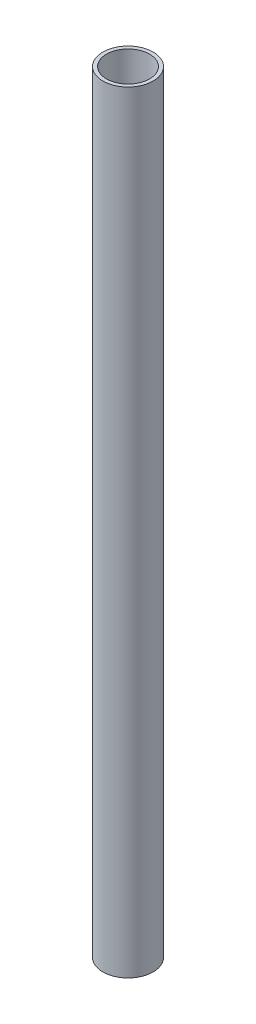
ISO-10303-21;
HEADER;
FILE_DESCRIPTION(('STEP AP214'),'2;1');
FILE_NAME('part.step','',(''),(''),'','','');
FILE_SCHEMA(('AUTOMOTIVE_DESIGN { 1 0 10303 214 1 1 1 1 }'));
ENDSEC;
DATA;
#1=APPLICATION_CONTEXT('core data for automotive mechanical design processes');
#2=APPLICATION_PROTOCOL_DEFINITION('international standard','automotive_design',2000,#1);
#3=PRODUCT_CONTEXT('',#1,'mechanical');
#4=PRODUCT('Part','Part','',(#3));
#5=PRODUCT_RELATED_PRODUCT_CATEGORY('part','',(#4));
#6=PRODUCT_DEFINITION_FORMATION('','',#4);
#7=PRODUCT_DEFINITION_CONTEXT('part definition',#1,'design');
#8=PRODUCT_DEFINITION('design','',#6,#7);
#9=PRODUCT_DEFINITION_SHAPE('','',#8);
#10=(LENGTH_UNIT() NAMED_UNIT(*) SI_UNIT(.MILLI.,.METRE.));
#11=(NAMED_UNIT(*) PLANE_ANGLE_UNIT() SI_UNIT($,.RADIAN.));
#12=(NAMED_UNIT(*) SI_UNIT($,.STERADIAN.) SOLID_ANGLE_UNIT());
#13=UNCERTAINTY_MEASURE_WITH_UNIT(LENGTH_MEASURE(1.E-05),#10,'distance_accuracy_value','');
#14=(GEOMETRIC_REPRESENTATION_CONTEXT(3) GLOBAL_UNCERTAINTY_ASSIGNED_CONTEXT((#13)) GLOBAL_UNIT_ASSIGNED_CONTEXT((#10,
#11,#12)) REPRESENTATION_CONTEXT('',''));
#15=CARTESIAN_POINT('',(0.,0.,0.));
#16=DIRECTION('',(0.,0.,1.));
#17=DIRECTION('',(1.,0.,0.));
#18=AXIS2_PLACEMENT_3D('',#15,#16,#17);
#19=CARTESIAN_POINT('',(0.,-107.5,0.));
#20=DIRECTION('',(0.,1.,0.));
#21=DIRECTION('',(-1.,0.,0.));
#22=AXIS2_PLACEMENT_3D('',#19,#20,#21);
#23=CYLINDRICAL_SURFACE('',#22,6.);
#24=CARTESIAN_POINT('',(0.,-107.5,0.));
#25=DIRECTION('',(0.,-1.,0.));
#26=DIRECTION('',(1.,0.,0.));
#27=AXIS2_PLACEMENT_3D('',#24,#25,#26);
#28=CIRCLE('',#27,6.);
#29=CARTESIAN_POINT('',(6.00000000000003,-107.5,0.));
#30=VERTEX_POINT('',#29);
#31=EDGE_CURVE('E45',#30,#30,#28,.T.);
#32=ORIENTED_EDGE('',*,*,#31,.T.);
#33=EDGE_LOOP('',(#32));
#34=FACE_BOUND('',#33,.T.);
#35=CARTESIAN_POINT('',(0.,107.5,0.));
#36=DIRECTION('',(0.,-1.,0.));
#37=DIRECTION('',(1.,0.,0.));
#38=AXIS2_PLACEMENT_3D('',#35,#36,#37);
#39=CIRCLE('',#38,6.);
#40=CARTESIAN_POINT('',(5.99999999999996,107.5,0.));
#41=VERTEX_POINT('',#40);
#42=EDGE_CURVE('E51',#41,#41,#39,.T.);
#43=ORIENTED_EDGE('',*,*,#42,.F.);
#44=EDGE_LOOP('',(#43));
#45=FACE_BOUND('',#44,.T.);
#46=ADVANCED_FACE('F38',(#34,#45),#23,.F.);
#47=CARTESIAN_POINT('',(0.,-107.5,0.));
#48=DIRECTION('',(0.,1.,0.));
#49=DIRECTION('',(-1.,0.,0.));
#50=AXIS2_PLACEMENT_3D('',#47,#48,#49);
#51=CYLINDRICAL_SURFACE('',#50,7.);
#52=CARTESIAN_POINT('',(0.,-107.5,0.));
#53=DIRECTION('',(0.,-1.,0.));
#54=DIRECTION('',(1.,0.,0.));
#55=AXIS2_PLACEMENT_3D('',#52,#53,#54);
#56=CIRCLE('',#55,7.);
#57=CARTESIAN_POINT('',(7.00000000000003,-107.5,0.));
#58=VERTEX_POINT('',#57);
#59=EDGE_CURVE('E11',#58,#58,#56,.T.);
#60=ORIENTED_EDGE('',*,*,#59,.F.);
#61=EDGE_LOOP('',(#60));
#62=FACE_BOUND('',#61,.T.);
#63=CARTESIAN_POINT('',(0.,107.5,0.));
#64=DIRECTION('',(0.,-1.,0.));
#65=DIRECTION('',(1.,0.,0.));
#66=AXIS2_PLACEMENT_3D('',#63,#64,#65);
#67=CIRCLE('',#66,7.);
#68=CARTESIAN_POINT('',(6.99999999999996,107.5,0.));
#69=VERTEX_POINT('',#68);
#70=EDGE_CURVE('E41',#69,#69,#67,.T.);
#71=ORIENTED_EDGE('',*,*,#70,.T.);
#72=EDGE_LOOP('',(#71));
#73=FACE_BOUND('',#72,.T.);
#74=ADVANCED_FACE('F58',(#62,#73),#51,.T.);
#75=CARTESIAN_POINT('',(0.,-107.5,0.));
#76=DIRECTION('',(0.,-1.,0.));
#77=DIRECTION('',(1.,0.,0.));
#78=AXIS2_PLACEMENT_3D('',#75,#76,#77);
#79=PLANE('',#78);
#80=ORIENTED_EDGE('',*,*,#31,.F.);
#81=EDGE_LOOP('',(#80));
#82=FACE_BOUND('',#81,.T.);
#83=ORIENTED_EDGE('',*,*,#59,.T.);
#84=EDGE_LOOP('',(#83));
#85=FACE_BOUND('',#84,.T.);
#86=ADVANCED_FACE('F62',(#82,#85),#79,.T.);
#87=CARTESIAN_POINT('',(0.,107.5,0.));
#88=DIRECTION('',(0.,-1.,0.));
#89=DIRECTION('',(1.,0.,0.));
#90=AXIS2_PLACEMENT_3D('',#87,#88,#89);
#91=PLANE('',#90);
#92=ORIENTED_EDGE('',*,*,#42,.T.);
#93=EDGE_LOOP('',(#92));
#94=FACE_BOUND('',#93,.T.);
#95=ORIENTED_EDGE('',*,*,#70,.F.);
#96=EDGE_LOOP('',(#95));
#97=FACE_BOUND('',#96,.T.);
#98=ADVANCED_FACE('F60',(#94,#97),#91,.F.);
#99=CLOSED_SHELL('',(#46,#74,#86,#98));
#100=MANIFOLD_SOLID_BREP('B2',#99);
#101=ADVANCED_BREP_SHAPE_REPRESENTATION('',(#18,#100),#14);
#102=SHAPE_DEFINITION_REPRESENTATION(#9,#101);
ENDSEC;
END-ISO-10303-21;
